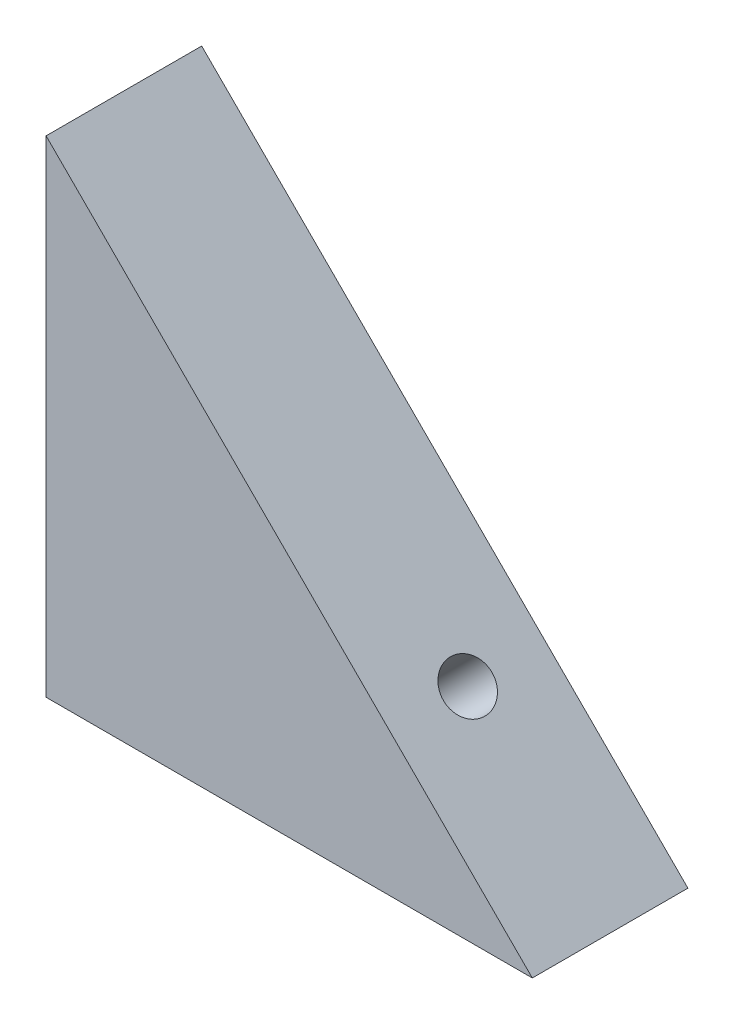
ISO-10303-21;
HEADER;
FILE_DESCRIPTION(('STEP AP214'),'2;1');
FILE_NAME('part.step','',(''),(''),'','','');
FILE_SCHEMA(('AUTOMOTIVE_DESIGN { 1 0 10303 214 1 1 1 1 }'));
ENDSEC;
DATA;
#1=APPLICATION_CONTEXT('core data for automotive mechanical design processes');
#2=APPLICATION_PROTOCOL_DEFINITION('international standard','automotive_design',2000,#1);
#3=PRODUCT_CONTEXT('',#1,'mechanical');
#4=PRODUCT('Part','Part','',(#3));
#5=PRODUCT_RELATED_PRODUCT_CATEGORY('part','',(#4));
#6=PRODUCT_DEFINITION_FORMATION('','',#4);
#7=PRODUCT_DEFINITION_CONTEXT('part definition',#1,'design');
#8=PRODUCT_DEFINITION('design','',#6,#7);
#9=PRODUCT_DEFINITION_SHAPE('','',#8);
#10=(LENGTH_UNIT() NAMED_UNIT(*) SI_UNIT(.MILLI.,.METRE.));
#11=(NAMED_UNIT(*) PLANE_ANGLE_UNIT() SI_UNIT($,.RADIAN.));
#12=(NAMED_UNIT(*) SI_UNIT($,.STERADIAN.) SOLID_ANGLE_UNIT());
#13=UNCERTAINTY_MEASURE_WITH_UNIT(LENGTH_MEASURE(1.E-05),#10,'distance_accuracy_value','');
#14=(GEOMETRIC_REPRESENTATION_CONTEXT(3) GLOBAL_UNCERTAINTY_ASSIGNED_CONTEXT((#13)) GLOBAL_UNIT_ASSIGNED_CONTEXT((#10,
#11,#12)) REPRESENTATION_CONTEXT('',''));
#15=CARTESIAN_POINT('',(0.,0.,0.));
#16=DIRECTION('',(0.,0.,1.));
#17=DIRECTION('',(1.,0.,0.));
#18=AXIS2_PLACEMENT_3D('',#15,#16,#17);
#19=CARTESIAN_POINT('',(-17.3029947000501,-32.2358475927408,8.));
#20=DIRECTION('',(-0.707106781186551,-0.707106781186544,0.));
#21=DIRECTION('',(0.707106781186544,-0.707106781186551,0.));
#22=AXIS2_PLACEMENT_3D('',#19,#20,#21);
#23=PLANE('',#22);
#24=CARTESIAN_POINT('',(-24.6253251703863,-24.9135171224046,4.));
#25=DIRECTION('',(0.707106781186551,0.707106781186544,0.));
#26=DIRECTION('',(-0.707106781186544,0.707106781186551,0.));
#27=AXIS2_PLACEMENT_3D('',#24,#25,#26);
#28=CIRCLE('',#27,1.24999999999999);
#29=CARTESIAN_POINT('',(-25.5092086468694,-24.0296336459214,4.));
#30=VERTEX_POINT('',#29);
#31=EDGE_CURVE('E93',#30,#30,#28,.T.);
#32=ORIENTED_EDGE('',*,*,#31,.F.);
#33=EDGE_LOOP('',(#32));
#34=FACE_BOUND('',#33,.T.);
#35=DIRECTION('',(-0.707106781186544,0.707106781186551,0.));
#36=VECTOR('',#35,1.);
#37=CARTESIAN_POINT('',(-17.3029947000501,-32.2358475927408,0.));
#38=LINE('',#37,#36);
#39=CARTESIAN_POINT('',(-17.3029947000501,-32.2358475927408,0.));
#40=VERTEX_POINT('',#39);
#41=CARTESIAN_POINT('',(-42.3029947000499,-7.23584759274083,0.));
#42=VERTEX_POINT('',#41);
#43=EDGE_CURVE('E86',#40,#42,#38,.T.);
#44=ORIENTED_EDGE('',*,*,#43,.T.);
#45=DIRECTION('',(0.,0.,-1.));
#46=VECTOR('',#45,1.);
#47=CARTESIAN_POINT('',(-42.3029947000499,-7.23584759274083,8.));
#48=LINE('',#47,#46);
#49=CARTESIAN_POINT('',(-42.3029947000499,-7.23584759274083,8.));
#50=VERTEX_POINT('',#49);
#51=EDGE_CURVE('E11',#50,#42,#48,.T.);
#52=ORIENTED_EDGE('',*,*,#51,.F.);
#53=DIRECTION('',(-0.707106781186544,0.707106781186551,0.));
#54=VECTOR('',#53,1.);
#55=CARTESIAN_POINT('',(-17.3029947000501,-32.2358475927408,8.));
#56=LINE('',#55,#54);
#57=CARTESIAN_POINT('',(-17.3029947000501,-32.2358475927408,8.));
#58=VERTEX_POINT('',#57);
#59=EDGE_CURVE('E79',#58,#50,#56,.T.);
#60=ORIENTED_EDGE('',*,*,#59,.F.);
#61=DIRECTION('',(0.,0.,-1.));
#62=VECTOR('',#61,1.);
#63=CARTESIAN_POINT('',(-17.3029947000501,-32.2358475927408,8.));
#64=LINE('',#63,#62);
#65=EDGE_CURVE('E87',#58,#40,#64,.T.);
#66=ORIENTED_EDGE('',*,*,#65,.T.);
#67=EDGE_LOOP('',(#44,#52,#60,#66));
#68=FACE_BOUND('',#67,.T.);
#69=ADVANCED_FACE('F39',(#34,#68),#23,.F.);
#70=CARTESIAN_POINT('',(-42.3029947000499,-7.23584759274083,8.));
#71=DIRECTION('',(1.,0.,0.));
#72=DIRECTION('',(0.,0.,-1.));
#73=AXIS2_PLACEMENT_3D('',#70,#71,#72);
#74=PLANE('',#73);
#75=DIRECTION('',(0.,-1.,0.));
#76=VECTOR('',#75,1.);
#77=CARTESIAN_POINT('',(-42.3029947000499,-7.23584759274083,0.));
#78=LINE('',#77,#76);
#79=CARTESIAN_POINT('',(-42.3029947000499,-32.2358475927408,0.));
#80=VERTEX_POINT('',#79);
#81=EDGE_CURVE('E67',#42,#80,#78,.T.);
#82=ORIENTED_EDGE('',*,*,#81,.T.);
#83=DIRECTION('',(0.,0.,-1.));
#84=VECTOR('',#83,1.);
#85=CARTESIAN_POINT('',(-42.3029947000499,-32.2358475927408,8.));
#86=LINE('',#85,#84);
#87=CARTESIAN_POINT('',(-42.3029947000499,-32.2358475927408,8.));
#88=VERTEX_POINT('',#87);
#89=EDGE_CURVE('E47',#88,#80,#86,.T.);
#90=ORIENTED_EDGE('',*,*,#89,.F.);
#91=DIRECTION('',(0.,-1.,0.));
#92=VECTOR('',#91,1.);
#93=CARTESIAN_POINT('',(-42.3029947000499,-7.23584759274083,8.));
#94=LINE('',#93,#92);
#95=EDGE_CURVE('E75',#50,#88,#94,.T.);
#96=ORIENTED_EDGE('',*,*,#95,.F.);
#97=ORIENTED_EDGE('',*,*,#51,.T.);
#98=EDGE_LOOP('',(#82,#90,#96,#97));
#99=FACE_BOUND('',#98,.T.);
#100=ADVANCED_FACE('F76',(#99),#74,.F.);
#101=CARTESIAN_POINT('',(-42.3029947000499,-32.2358475927408,8.));
#102=DIRECTION('',(0.,1.,0.));
#103=DIRECTION('',(0.,0.,1.));
#104=AXIS2_PLACEMENT_3D('',#101,#102,#103);
#105=PLANE('',#104);
#106=DIRECTION('',(1.,0.,0.));
#107=VECTOR('',#106,1.);
#108=CARTESIAN_POINT('',(-42.3029947000499,-32.2358475927408,0.));
#109=LINE('',#108,#107);
#110=EDGE_CURVE('E72',#80,#40,#109,.T.);
#111=ORIENTED_EDGE('',*,*,#110,.T.);
#112=ORIENTED_EDGE('',*,*,#65,.F.);
#113=DIRECTION('',(1.,0.,0.));
#114=VECTOR('',#113,1.);
#115=CARTESIAN_POINT('',(-42.3029947000499,-32.2358475927408,8.));
#116=LINE('',#115,#114);
#117=EDGE_CURVE('E55',#88,#58,#116,.T.);
#118=ORIENTED_EDGE('',*,*,#117,.F.);
#119=ORIENTED_EDGE('',*,*,#89,.T.);
#120=EDGE_LOOP('',(#111,#112,#118,#119));
#121=FACE_BOUND('',#120,.T.);
#122=ADVANCED_FACE('F98',(#121),#105,.F.);
#123=CARTESIAN_POINT('',(0.,0.,8.));
#124=DIRECTION('',(0.,0.,1.));
#125=DIRECTION('',(1.,0.,0.));
#126=AXIS2_PLACEMENT_3D('',#123,#124,#125);
#127=PLANE('',#126);
#128=ORIENTED_EDGE('',*,*,#59,.T.);
#129=ORIENTED_EDGE('',*,*,#95,.T.);
#130=ORIENTED_EDGE('',*,*,#117,.T.);
#131=EDGE_LOOP('',(#128,#129,#130));
#132=FACE_BOUND('',#131,.T.);
#133=ADVANCED_FACE('F82',(#132),#127,.T.);
#134=CARTESIAN_POINT('',(0.,0.,0.));
#135=DIRECTION('',(0.,0.,1.));
#136=DIRECTION('',(1.,0.,0.));
#137=AXIS2_PLACEMENT_3D('',#134,#135,#136);
#138=PLANE('',#137);
#139=ORIENTED_EDGE('',*,*,#43,.F.);
#140=ORIENTED_EDGE('',*,*,#110,.F.);
#141=ORIENTED_EDGE('',*,*,#81,.F.);
#142=EDGE_LOOP('',(#139,#140,#141));
#143=FACE_BOUND('',#142,.T.);
#144=ADVANCED_FACE('F99',(#143),#138,.F.);
#145=CARTESIAN_POINT('',(-28.160859076319,-28.4490510283373,4.));
#146=DIRECTION('',(-0.707106781186551,-0.707106781186544,0.));
#147=DIRECTION('',(0.707106781186544,-0.707106781186551,0.));
#148=AXIS2_PLACEMENT_3D('',#145,#146,#147);
#149=PLANE('',#148);
#150=CARTESIAN_POINT('',(-28.160859076319,-28.4490510283373,4.));
#151=DIRECTION('',(0.707106781186551,0.707106781186544,0.));
#152=DIRECTION('',(-0.707106781186544,0.707106781186551,0.));
#153=AXIS2_PLACEMENT_3D('',#150,#151,#152);
#154=CIRCLE('',#153,1.25);
#155=CARTESIAN_POINT('',(-29.0447425528022,-27.5651675518541,4.));
#156=VERTEX_POINT('',#155);
#157=EDGE_CURVE('E89',#156,#156,#154,.T.);
#158=ORIENTED_EDGE('',*,*,#157,.T.);
#159=EDGE_LOOP('',(#158));
#160=FACE_BOUND('',#159,.T.);
#161=ADVANCED_FACE('F101',(#160),#149,.F.);
#162=CARTESIAN_POINT('',(-24.6253251703863,-24.9135171224046,4.));
#163=DIRECTION('',(0.707106781186551,0.707106781186544,0.));
#164=DIRECTION('',(-0.707106781186544,0.707106781186551,0.));
#165=AXIS2_PLACEMENT_3D('',#162,#163,#164);
#166=CYLINDRICAL_SURFACE('',#165,1.24999999999999);
#167=ORIENTED_EDGE('',*,*,#157,.F.);
#168=EDGE_LOOP('',(#167));
#169=FACE_BOUND('',#168,.T.);
#170=ORIENTED_EDGE('',*,*,#31,.T.);
#171=EDGE_LOOP('',(#170));
#172=FACE_BOUND('',#171,.T.);
#173=ADVANCED_FACE('F107',(#169,#172),#166,.F.);
#174=CLOSED_SHELL('',(#69,#100,#122,#133,#144,#161,#173));
#175=MANIFOLD_SOLID_BREP('B2',#174);
#176=ADVANCED_BREP_SHAPE_REPRESENTATION('',(#18,#175),#14);
#177=SHAPE_DEFINITION_REPRESENTATION(#9,#176);
ENDSEC;
END-ISO-10303-21;
